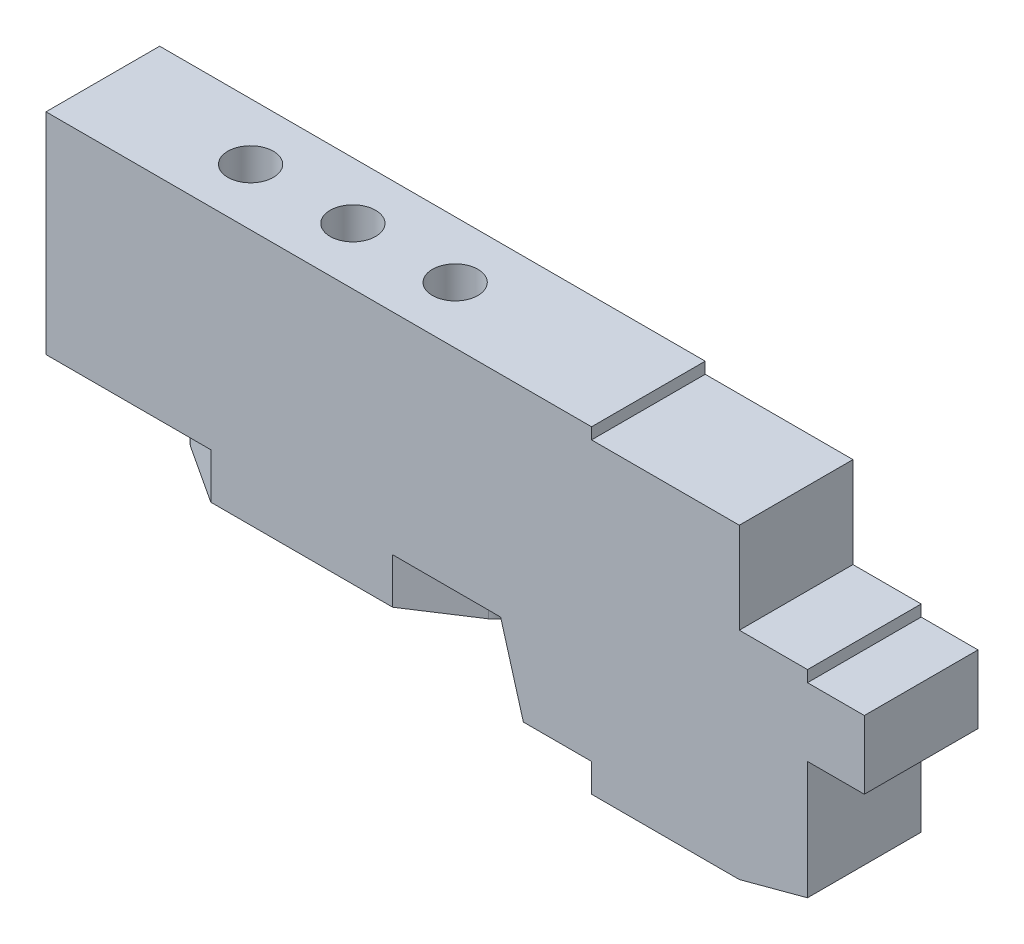
ISO-10303-21;
HEADER;
FILE_DESCRIPTION(('STEP AP214'),'2;1');
FILE_NAME('part.step','',(''),(''),'','','');
FILE_SCHEMA(('AUTOMOTIVE_DESIGN { 1 0 10303 214 1 1 1 1 }'));
ENDSEC;
DATA;
#1=APPLICATION_CONTEXT('core data for automotive mechanical design processes');
#2=APPLICATION_PROTOCOL_DEFINITION('international standard','automotive_design',2000,#1);
#3=PRODUCT_CONTEXT('',#1,'mechanical');
#4=PRODUCT('Part','Part','',(#3));
#5=PRODUCT_RELATED_PRODUCT_CATEGORY('part','',(#4));
#6=PRODUCT_DEFINITION_FORMATION('','',#4);
#7=PRODUCT_DEFINITION_CONTEXT('part definition',#1,'design');
#8=PRODUCT_DEFINITION('design','',#6,#7);
#9=PRODUCT_DEFINITION_SHAPE('','',#8);
#10=(LENGTH_UNIT() NAMED_UNIT(*) SI_UNIT(.MILLI.,.METRE.));
#11=(NAMED_UNIT(*) PLANE_ANGLE_UNIT() SI_UNIT($,.RADIAN.));
#12=(NAMED_UNIT(*) SI_UNIT($,.STERADIAN.) SOLID_ANGLE_UNIT());
#13=UNCERTAINTY_MEASURE_WITH_UNIT(LENGTH_MEASURE(1.E-05),#10,'distance_accuracy_value','');
#14=(GEOMETRIC_REPRESENTATION_CONTEXT(3) GLOBAL_UNCERTAINTY_ASSIGNED_CONTEXT((#13)) GLOBAL_UNIT_ASSIGNED_CONTEXT((#10,
#11,#12)) REPRESENTATION_CONTEXT('',''));
#15=CARTESIAN_POINT('',(0.,0.,0.));
#16=DIRECTION('',(0.,0.,1.));
#17=DIRECTION('',(1.,0.,0.));
#18=AXIS2_PLACEMENT_3D('',#15,#16,#17);
#19=CARTESIAN_POINT('',(16.,-9.25,10.));
#20=DIRECTION('',(0.,1.,0.));
#21=DIRECTION('',(-1.,0.,0.));
#22=AXIS2_PLACEMENT_3D('',#19,#20,#21);
#23=PLANE('',#22);
#24=DIRECTION('',(0.837342685882753,0.,0.546678357353441));
#25=VECTOR('',#24,1.);
#26=CARTESIAN_POINT('',(6.5,-9.25,0.));
#27=LINE('',#26,#25);
#28=CARTESIAN_POINT('',(6.5,-9.25,0.));
#29=VERTEX_POINT('',#28);
#30=CARTESIAN_POINT('',(11.5933567147069,-9.25,3.32531462823448));
#31=VERTEX_POINT('',#30);
#32=EDGE_CURVE('E389',#29,#31,#27,.T.);
#33=ORIENTED_EDGE('',*,*,#32,.F.);
#34=DIRECTION('',(1.,0.,0.));
#35=VECTOR('',#34,1.);
#36=CARTESIAN_POINT('',(16.,-9.25,0.));
#37=LINE('',#36,#35);
#38=CARTESIAN_POINT('',(16.,-9.25,0.));
#39=VERTEX_POINT('',#38);
#40=EDGE_CURVE('E231',#29,#39,#37,.T.);
#41=ORIENTED_EDGE('',*,*,#40,.T.);
#42=DIRECTION('',(0.,0.,-1.));
#43=VECTOR('',#42,1.);
#44=CARTESIAN_POINT('',(16.,-9.25,10.));
#45=LINE('',#44,#43);
#46=CARTESIAN_POINT('',(16.,-9.25,10.));
#47=VERTEX_POINT('',#46);
#48=EDGE_CURVE('E44',#47,#39,#45,.T.);
#49=ORIENTED_EDGE('',*,*,#48,.F.);
#50=DIRECTION('',(1.,0.,0.));
#51=VECTOR('',#50,1.);
#52=CARTESIAN_POINT('',(16.,-9.25,10.));
#53=LINE('',#52,#51);
#54=CARTESIAN_POINT('',(6.5,-9.25,10.));
#55=VERTEX_POINT('',#54);
#56=EDGE_CURVE('E240',#55,#47,#53,.T.);
#57=ORIENTED_EDGE('',*,*,#56,.F.);
#58=DIRECTION('',(-0.837342685882753,0.,0.546678357353441));
#59=VECTOR('',#58,1.);
#60=CARTESIAN_POINT('',(6.5,-9.25,10.));
#61=LINE('',#60,#59);
#62=CARTESIAN_POINT('',(11.5933567147069,-9.25,6.67468537176551));
#63=VERTEX_POINT('',#62);
#64=EDGE_CURVE('E56',#63,#55,#61,.T.);
#65=ORIENTED_EDGE('',*,*,#64,.F.);
#66=CARTESIAN_POINT('',(10.5,-9.25,5.));
#67=DIRECTION('',(0.,-1.,0.));
#68=DIRECTION('',(1.,0.,0.));
#69=AXIS2_PLACEMENT_3D('',#66,#67,#68);
#70=CIRCLE('',#69,2.);
#71=EDGE_CURVE('E51',#31,#63,#70,.T.);
#72=ORIENTED_EDGE('',*,*,#71,.F.);
#73=EDGE_LOOP('',(#33,#41,#49,#57,#65,#72));
#74=FACE_BOUND('',#73,.T.);
#75=ADVANCED_FACE('F36',(#74),#23,.F.);
#76=CARTESIAN_POINT('',(-24.,-9.25,10.));
#77=DIRECTION('',(1.,0.,0.));
#78=DIRECTION('',(0.,0.,-1.));
#79=AXIS2_PLACEMENT_3D('',#76,#77,#78);
#80=PLANE('',#79);
#81=DIRECTION('',(0.,-1.,0.));
#82=VECTOR('',#81,1.);
#83=CARTESIAN_POINT('',(-24.,-9.25,0.));
#84=LINE('',#83,#82);
#85=CARTESIAN_POINT('',(-24.,9.25,0.));
#86=VERTEX_POINT('',#85);
#87=CARTESIAN_POINT('',(-24.,-9.25,0.));
#88=VERTEX_POINT('',#87);
#89=EDGE_CURVE('E228',#86,#88,#84,.T.);
#90=ORIENTED_EDGE('',*,*,#89,.T.);
#91=DIRECTION('',(0.,0.,-1.));
#92=VECTOR('',#91,1.);
#93=CARTESIAN_POINT('',(-24.,-9.25,10.));
#94=LINE('',#93,#92);
#95=CARTESIAN_POINT('',(-24.,-9.25,10.));
#96=VERTEX_POINT('',#95);
#97=EDGE_CURVE('E11',#96,#88,#94,.T.);
#98=ORIENTED_EDGE('',*,*,#97,.F.);
#99=DIRECTION('',(0.,-1.,0.));
#100=VECTOR('',#99,1.);
#101=CARTESIAN_POINT('',(-24.,-9.25,10.));
#102=LINE('',#101,#100);
#103=CARTESIAN_POINT('',(-24.,9.25,10.));
#104=VERTEX_POINT('',#103);
#105=EDGE_CURVE('E237',#104,#96,#102,.T.);
#106=ORIENTED_EDGE('',*,*,#105,.F.);
#107=DIRECTION('',(0.,0.,-1.));
#108=VECTOR('',#107,1.);
#109=CARTESIAN_POINT('',(-24.,9.25,10.));
#110=LINE('',#109,#108);
#111=EDGE_CURVE('E274',#104,#86,#110,.T.);
#112=ORIENTED_EDGE('',*,*,#111,.T.);
#113=EDGE_LOOP('',(#90,#98,#106,#112));
#114=FACE_BOUND('',#113,.T.);
#115=ADVANCED_FACE('F38',(#114),#80,.F.);
#116=DIRECTION('',(0.837342685882753,0.,-0.546678357353441));
#117=VECTOR('',#116,1.);
#118=CARTESIAN_POINT('',(-14.5933567147069,-9.25,3.32531462823449));
#119=LINE('',#118,#117);
#120=CARTESIAN_POINT('',(-14.5933567147069,-9.25,3.32531462823449));
#121=VERTEX_POINT('',#120);
#122=CARTESIAN_POINT('',(-9.5,-9.25,0.));
#123=VERTEX_POINT('',#122);
#124=EDGE_CURVE('E419',#121,#123,#119,.T.);
#125=ORIENTED_EDGE('',*,*,#124,.F.);
#126=CARTESIAN_POINT('',(-13.5,-9.25,5.));
#127=DIRECTION('',(0.,-1.,0.));
#128=DIRECTION('',(1.,0.,0.));
#129=AXIS2_PLACEMENT_3D('',#126,#127,#128);
#130=CIRCLE('',#129,2.);
#131=CARTESIAN_POINT('',(-14.5933567147069,-9.25,6.67468537176551));
#132=VERTEX_POINT('',#131);
#133=EDGE_CURVE('E227',#132,#121,#130,.T.);
#134=ORIENTED_EDGE('',*,*,#133,.F.);
#135=DIRECTION('',(-0.837342685882753,0.,-0.546678357353441));
#136=VECTOR('',#135,1.);
#137=CARTESIAN_POINT('',(-14.5933567147069,-9.25,6.67468537176551));
#138=LINE('',#137,#136);
#139=CARTESIAN_POINT('',(-9.5,-9.25,10.));
#140=VERTEX_POINT('',#139);
#141=EDGE_CURVE('E224',#140,#132,#138,.T.);
#142=ORIENTED_EDGE('',*,*,#141,.F.);
#143=EDGE_CURVE('E242',#96,#140,#53,.T.);
#144=ORIENTED_EDGE('',*,*,#143,.F.);
#145=ORIENTED_EDGE('',*,*,#97,.T.);
#146=EDGE_CURVE('E276',#88,#123,#37,.T.);
#147=ORIENTED_EDGE('',*,*,#146,.T.);
#148=EDGE_LOOP('',(#125,#134,#142,#144,#145,#147));
#149=FACE_BOUND('',#148,.T.);
#150=ADVANCED_FACE('F422',(#149),#23,.F.);
#151=CARTESIAN_POINT('',(18.,-16.25,10.));
#152=DIRECTION('',(0.961523947640823,0.274721127897378,0.));
#153=DIRECTION('',(-0.274721127897378,0.961523947640823,0.));
#154=AXIS2_PLACEMENT_3D('',#151,#152,#153);
#155=PLANE('',#154);
#156=DIRECTION('',(0.274721127897378,-0.961523947640823,0.));
#157=VECTOR('',#156,1.);
#158=CARTESIAN_POINT('',(18.,-16.25,0.));
#159=LINE('',#158,#157);
#160=CARTESIAN_POINT('',(18.,-16.25,0.));
#161=VERTEX_POINT('',#160);
#162=EDGE_CURVE('E278',#39,#161,#159,.T.);
#163=ORIENTED_EDGE('',*,*,#162,.T.);
#164=DIRECTION('',(0.,0.,-1.));
#165=VECTOR('',#164,1.);
#166=CARTESIAN_POINT('',(18.,-16.25,10.));
#167=LINE('',#166,#165);
#168=CARTESIAN_POINT('',(18.,-16.25,10.));
#169=VERTEX_POINT('',#168);
#170=EDGE_CURVE('E348',#169,#161,#167,.T.);
#171=ORIENTED_EDGE('',*,*,#170,.F.);
#172=DIRECTION('',(0.274721127897378,-0.961523947640823,0.));
#173=VECTOR('',#172,1.);
#174=CARTESIAN_POINT('',(18.,-16.25,10.));
#175=LINE('',#174,#173);
#176=EDGE_CURVE('E245',#47,#169,#175,.T.);
#177=ORIENTED_EDGE('',*,*,#176,.F.);
#178=ORIENTED_EDGE('',*,*,#48,.T.);
#179=EDGE_LOOP('',(#163,#171,#177,#178));
#180=FACE_BOUND('',#179,.T.);
#181=ADVANCED_FACE('F355',(#180),#155,.F.);
#182=CARTESIAN_POINT('',(18.,-16.25,10.));
#183=DIRECTION('',(0.,1.,0.));
#184=DIRECTION('',(0.,0.,1.));
#185=AXIS2_PLACEMENT_3D('',#182,#183,#184);
#186=PLANE('',#185);
#187=DIRECTION('',(1.,0.,0.));
#188=VECTOR('',#187,1.);
#189=CARTESIAN_POINT('',(18.,-16.25,0.));
#190=LINE('',#189,#188);
#191=CARTESIAN_POINT('',(24.,-16.25,0.));
#192=VERTEX_POINT('',#191);
#193=EDGE_CURVE('E280',#161,#192,#190,.T.);
#194=ORIENTED_EDGE('',*,*,#193,.T.);
#195=DIRECTION('',(0.,0.,-1.));
#196=VECTOR('',#195,1.);
#197=CARTESIAN_POINT('',(24.,-16.25,10.));
#198=LINE('',#197,#196);
#199=CARTESIAN_POINT('',(24.,-16.25,10.));
#200=VERTEX_POINT('',#199);
#201=EDGE_CURVE('E345',#200,#192,#198,.T.);
#202=ORIENTED_EDGE('',*,*,#201,.F.);
#203=DIRECTION('',(1.,0.,0.));
#204=VECTOR('',#203,1.);
#205=CARTESIAN_POINT('',(18.,-16.25,10.));
#206=LINE('',#205,#204);
#207=EDGE_CURVE('E247',#169,#200,#206,.T.);
#208=ORIENTED_EDGE('',*,*,#207,.F.);
#209=ORIENTED_EDGE('',*,*,#170,.T.);
#210=EDGE_LOOP('',(#194,#202,#208,#209));
#211=FACE_BOUND('',#210,.T.);
#212=ADVANCED_FACE('F366',(#211),#186,.F.);
#213=CARTESIAN_POINT('',(24.,-16.25,10.));
#214=DIRECTION('',(1.,0.,0.));
#215=DIRECTION('',(0.,0.,-1.));
#216=AXIS2_PLACEMENT_3D('',#213,#214,#215);
#217=PLANE('',#216);
#218=DIRECTION('',(0.,-1.,0.));
#219=VECTOR('',#218,1.);
#220=CARTESIAN_POINT('',(24.,-16.25,0.));
#221=LINE('',#220,#219);
#222=CARTESIAN_POINT('',(24.,-18.75,0.));
#223=VERTEX_POINT('',#222);
#224=EDGE_CURVE('E282',#192,#223,#221,.T.);
#225=ORIENTED_EDGE('',*,*,#224,.T.);
#226=DIRECTION('',(0.,0.,-1.));
#227=VECTOR('',#226,1.);
#228=CARTESIAN_POINT('',(24.,-18.75,10.));
#229=LINE('',#228,#227);
#230=CARTESIAN_POINT('',(24.,-18.75,10.));
#231=VERTEX_POINT('',#230);
#232=EDGE_CURVE('E342',#231,#223,#229,.T.);
#233=ORIENTED_EDGE('',*,*,#232,.F.);
#234=DIRECTION('',(0.,-1.,0.));
#235=VECTOR('',#234,1.);
#236=CARTESIAN_POINT('',(24.,-16.25,10.));
#237=LINE('',#236,#235);
#238=EDGE_CURVE('E249',#200,#231,#237,.T.);
#239=ORIENTED_EDGE('',*,*,#238,.F.);
#240=ORIENTED_EDGE('',*,*,#201,.T.);
#241=EDGE_LOOP('',(#225,#233,#239,#240));
#242=FACE_BOUND('',#241,.T.);
#243=ADVANCED_FACE('F370',(#242),#217,.F.);
#244=CARTESIAN_POINT('',(24.,-18.75,10.));
#245=DIRECTION('',(0.,1.,0.));
#246=DIRECTION('',(0.,0.,1.));
#247=AXIS2_PLACEMENT_3D('',#244,#245,#246);
#248=PLANE('',#247);
#249=DIRECTION('',(1.,0.,0.));
#250=VECTOR('',#249,1.);
#251=CARTESIAN_POINT('',(24.,-18.75,0.));
#252=LINE('',#251,#250);
#253=CARTESIAN_POINT('',(37.,-18.75,0.));
#254=VERTEX_POINT('',#253);
#255=EDGE_CURVE('E284',#223,#254,#252,.T.);
#256=ORIENTED_EDGE('',*,*,#255,.T.);
#257=DIRECTION('',(0.,0.,-1.));
#258=VECTOR('',#257,1.);
#259=CARTESIAN_POINT('',(37.,-18.75,10.));
#260=LINE('',#259,#258);
#261=CARTESIAN_POINT('',(37.,-18.75,10.));
#262=VERTEX_POINT('',#261);
#263=EDGE_CURVE('E339',#262,#254,#260,.T.);
#264=ORIENTED_EDGE('',*,*,#263,.F.);
#265=DIRECTION('',(1.,0.,0.));
#266=VECTOR('',#265,1.);
#267=CARTESIAN_POINT('',(24.,-18.75,10.));
#268=LINE('',#267,#266);
#269=EDGE_CURVE('E251',#231,#262,#268,.T.);
#270=ORIENTED_EDGE('',*,*,#269,.F.);
#271=ORIENTED_EDGE('',*,*,#232,.T.);
#272=EDGE_LOOP('',(#256,#264,#270,#271));
#273=FACE_BOUND('',#272,.T.);
#274=ADVANCED_FACE('F482',(#273),#248,.F.);
#275=CARTESIAN_POINT('',(37.,-18.75,10.));
#276=DIRECTION('',(-0.258819045102522,0.965925826289068,0.));
#277=DIRECTION('',(-0.965925826289068,-0.258819045102522,0.));
#278=AXIS2_PLACEMENT_3D('',#275,#276,#277);
#279=PLANE('',#278);
#280=DIRECTION('',(0.965925826289068,0.258819045102522,0.));
#281=VECTOR('',#280,1.);
#282=CARTESIAN_POINT('',(37.,-18.75,0.));
#283=LINE('',#282,#281);
#284=CARTESIAN_POINT('',(43.,-17.1423048454132,0.));
#285=VERTEX_POINT('',#284);
#286=EDGE_CURVE('E286',#254,#285,#283,.T.);
#287=ORIENTED_EDGE('',*,*,#286,.T.);
#288=DIRECTION('',(0.,0.,-1.));
#289=VECTOR('',#288,1.);
#290=CARTESIAN_POINT('',(43.,-17.1423048454132,10.));
#291=LINE('',#290,#289);
#292=CARTESIAN_POINT('',(43.,-17.1423048454132,10.));
#293=VERTEX_POINT('',#292);
#294=EDGE_CURVE('E336',#293,#285,#291,.T.);
#295=ORIENTED_EDGE('',*,*,#294,.F.);
#296=DIRECTION('',(0.965925826289068,0.258819045102522,0.));
#297=VECTOR('',#296,1.);
#298=CARTESIAN_POINT('',(37.,-18.75,10.));
#299=LINE('',#298,#297);
#300=EDGE_CURVE('E253',#262,#293,#299,.T.);
#301=ORIENTED_EDGE('',*,*,#300,.F.);
#302=ORIENTED_EDGE('',*,*,#263,.T.);
#303=EDGE_LOOP('',(#287,#295,#301,#302));
#304=FACE_BOUND('',#303,.T.);
#305=ADVANCED_FACE('F480',(#304),#279,.F.);
#306=CARTESIAN_POINT('',(43.,-17.1423048454132,10.));
#307=DIRECTION('',(-1.,0.,0.));
#308=DIRECTION('',(0.,0.,1.));
#309=AXIS2_PLACEMENT_3D('',#306,#307,#308);
#310=PLANE('',#309);
#311=DIRECTION('',(0.,1.,0.));
#312=VECTOR('',#311,1.);
#313=CARTESIAN_POINT('',(43.,-17.1423048454132,0.));
#314=LINE('',#313,#312);
#315=CARTESIAN_POINT('',(43.,-6.74999999999999,0.));
#316=VERTEX_POINT('',#315);
#317=EDGE_CURVE('E288',#285,#316,#314,.T.);
#318=ORIENTED_EDGE('',*,*,#317,.T.);
#319=DIRECTION('',(0.,0.,-1.));
#320=VECTOR('',#319,1.);
#321=CARTESIAN_POINT('',(43.,-6.74999999999999,10.));
#322=LINE('',#321,#320);
#323=CARTESIAN_POINT('',(43.,-6.74999999999999,10.));
#324=VERTEX_POINT('',#323);
#325=EDGE_CURVE('E333',#324,#316,#322,.T.);
#326=ORIENTED_EDGE('',*,*,#325,.F.);
#327=DIRECTION('',(0.,1.,0.));
#328=VECTOR('',#327,1.);
#329=CARTESIAN_POINT('',(43.,-17.1423048454132,10.));
#330=LINE('',#329,#328);
#331=EDGE_CURVE('E255',#293,#324,#330,.T.);
#332=ORIENTED_EDGE('',*,*,#331,.F.);
#333=ORIENTED_EDGE('',*,*,#294,.T.);
#334=EDGE_LOOP('',(#318,#326,#332,#333));
#335=FACE_BOUND('',#334,.T.);
#336=ADVANCED_FACE('F476',(#335),#310,.F.);
#337=CARTESIAN_POINT('',(43.,-6.74999999999999,10.));
#338=DIRECTION('',(0.,1.,0.));
#339=DIRECTION('',(0.,0.,1.));
#340=AXIS2_PLACEMENT_3D('',#337,#338,#339);
#341=PLANE('',#340);
#342=DIRECTION('',(1.,0.,0.));
#343=VECTOR('',#342,1.);
#344=CARTESIAN_POINT('',(43.,-6.74999999999999,0.));
#345=LINE('',#344,#343);
#346=CARTESIAN_POINT('',(48.,-6.74999999999999,0.));
#347=VERTEX_POINT('',#346);
#348=EDGE_CURVE('E290',#316,#347,#345,.T.);
#349=ORIENTED_EDGE('',*,*,#348,.T.);
#350=DIRECTION('',(0.,0.,-1.));
#351=VECTOR('',#350,1.);
#352=CARTESIAN_POINT('',(48.,-6.74999999999999,10.));
#353=LINE('',#352,#351);
#354=CARTESIAN_POINT('',(48.,-6.74999999999999,10.));
#355=VERTEX_POINT('',#354);
#356=EDGE_CURVE('E330',#355,#347,#353,.T.);
#357=ORIENTED_EDGE('',*,*,#356,.F.);
#358=DIRECTION('',(1.,0.,0.));
#359=VECTOR('',#358,1.);
#360=CARTESIAN_POINT('',(43.,-6.74999999999999,10.));
#361=LINE('',#360,#359);
#362=EDGE_CURVE('E257',#324,#355,#361,.T.);
#363=ORIENTED_EDGE('',*,*,#362,.F.);
#364=ORIENTED_EDGE('',*,*,#325,.T.);
#365=EDGE_LOOP('',(#349,#357,#363,#364));
#366=FACE_BOUND('',#365,.T.);
#367=ADVANCED_FACE('F471',(#366),#341,.F.);
#368=CARTESIAN_POINT('',(48.,-6.74999999999999,10.));
#369=DIRECTION('',(-1.,0.,0.));
#370=DIRECTION('',(0.,0.,1.));
#371=AXIS2_PLACEMENT_3D('',#368,#369,#370);
#372=PLANE('',#371);
#373=DIRECTION('',(0.,1.,0.));
#374=VECTOR('',#373,1.);
#375=CARTESIAN_POINT('',(48.,-6.74999999999999,0.));
#376=LINE('',#375,#374);
#377=CARTESIAN_POINT('',(48.,-0.749999999999994,0.));
#378=VERTEX_POINT('',#377);
#379=EDGE_CURVE('E292',#347,#378,#376,.T.);
#380=ORIENTED_EDGE('',*,*,#379,.T.);
#381=DIRECTION('',(0.,0.,-1.));
#382=VECTOR('',#381,1.);
#383=CARTESIAN_POINT('',(48.,-0.749999999999994,10.));
#384=LINE('',#383,#382);
#385=CARTESIAN_POINT('',(48.,-0.749999999999994,10.));
#386=VERTEX_POINT('',#385);
#387=EDGE_CURVE('E327',#386,#378,#384,.T.);
#388=ORIENTED_EDGE('',*,*,#387,.F.);
#389=DIRECTION('',(0.,1.,0.));
#390=VECTOR('',#389,1.);
#391=CARTESIAN_POINT('',(48.,-6.74999999999999,10.));
#392=LINE('',#391,#390);
#393=EDGE_CURVE('E259',#355,#386,#392,.T.);
#394=ORIENTED_EDGE('',*,*,#393,.F.);
#395=ORIENTED_EDGE('',*,*,#356,.T.);
#396=EDGE_LOOP('',(#380,#388,#394,#395));
#397=FACE_BOUND('',#396,.T.);
#398=ADVANCED_FACE('F465',(#397),#372,.F.);
#399=CARTESIAN_POINT('',(48.,-0.749999999999994,10.));
#400=DIRECTION('',(0.,-1.,0.));
#401=DIRECTION('',(1.,0.,0.));
#402=AXIS2_PLACEMENT_3D('',#399,#400,#401);
#403=PLANE('',#402);
#404=DIRECTION('',(-1.,0.,0.));
#405=VECTOR('',#404,1.);
#406=CARTESIAN_POINT('',(48.,-0.749999999999994,0.));
#407=LINE('',#406,#405);
#408=CARTESIAN_POINT('',(43.,-0.749999999999995,0.));
#409=VERTEX_POINT('',#408);
#410=EDGE_CURVE('E294',#378,#409,#407,.T.);
#411=ORIENTED_EDGE('',*,*,#410,.T.);
#412=DIRECTION('',(0.,0.,-1.));
#413=VECTOR('',#412,1.);
#414=CARTESIAN_POINT('',(43.,-0.749999999999995,10.));
#415=LINE('',#414,#413);
#416=CARTESIAN_POINT('',(43.,-0.749999999999995,10.));
#417=VERTEX_POINT('',#416);
#418=EDGE_CURVE('E324',#417,#409,#415,.T.);
#419=ORIENTED_EDGE('',*,*,#418,.F.);
#420=DIRECTION('',(-1.,0.,0.));
#421=VECTOR('',#420,1.);
#422=CARTESIAN_POINT('',(48.,-0.749999999999994,10.));
#423=LINE('',#422,#421);
#424=EDGE_CURVE('E261',#386,#417,#423,.T.);
#425=ORIENTED_EDGE('',*,*,#424,.F.);
#426=ORIENTED_EDGE('',*,*,#387,.T.);
#427=EDGE_LOOP('',(#411,#419,#425,#426));
#428=FACE_BOUND('',#427,.T.);
#429=ADVANCED_FACE('F461',(#428),#403,.F.);
#430=CARTESIAN_POINT('',(43.,-0.749999999999995,10.));
#431=DIRECTION('',(-1.,0.,0.));
#432=DIRECTION('',(0.,0.,1.));
#433=AXIS2_PLACEMENT_3D('',#430,#431,#432);
#434=PLANE('',#433);
#435=DIRECTION('',(0.,1.,0.));
#436=VECTOR('',#435,1.);
#437=CARTESIAN_POINT('',(43.,-0.749999999999995,0.));
#438=LINE('',#437,#436);
#439=CARTESIAN_POINT('',(43.,0.250000000000006,0.));
#440=VERTEX_POINT('',#439);
#441=EDGE_CURVE('E296',#409,#440,#438,.T.);
#442=ORIENTED_EDGE('',*,*,#441,.T.);
#443=DIRECTION('',(0.,0.,-1.));
#444=VECTOR('',#443,1.);
#445=CARTESIAN_POINT('',(43.,0.250000000000006,10.));
#446=LINE('',#445,#444);
#447=CARTESIAN_POINT('',(43.,0.250000000000006,10.));
#448=VERTEX_POINT('',#447);
#449=EDGE_CURVE('E321',#448,#440,#446,.T.);
#450=ORIENTED_EDGE('',*,*,#449,.F.);
#451=DIRECTION('',(0.,1.,0.));
#452=VECTOR('',#451,1.);
#453=CARTESIAN_POINT('',(43.,-0.749999999999995,10.));
#454=LINE('',#453,#452);
#455=EDGE_CURVE('E263',#417,#448,#454,.T.);
#456=ORIENTED_EDGE('',*,*,#455,.F.);
#457=ORIENTED_EDGE('',*,*,#418,.T.);
#458=EDGE_LOOP('',(#442,#450,#456,#457));
#459=FACE_BOUND('',#458,.T.);
#460=ADVANCED_FACE('F456',(#459),#434,.F.);
#461=CARTESIAN_POINT('',(43.,0.250000000000006,10.));
#462=DIRECTION('',(0.,-1.,0.));
#463=DIRECTION('',(1.,0.,0.));
#464=AXIS2_PLACEMENT_3D('',#461,#462,#463);
#465=PLANE('',#464);
#466=DIRECTION('',(-1.,0.,0.));
#467=VECTOR('',#466,1.);
#468=CARTESIAN_POINT('',(43.,0.250000000000006,0.));
#469=LINE('',#468,#467);
#470=CARTESIAN_POINT('',(37.,0.250000000000005,0.));
#471=VERTEX_POINT('',#470);
#472=EDGE_CURVE('E298',#440,#471,#469,.T.);
#473=ORIENTED_EDGE('',*,*,#472,.T.);
#474=DIRECTION('',(0.,0.,-1.));
#475=VECTOR('',#474,1.);
#476=CARTESIAN_POINT('',(37.,0.250000000000005,10.));
#477=LINE('',#476,#475);
#478=CARTESIAN_POINT('',(37.,0.250000000000005,10.));
#479=VERTEX_POINT('',#478);
#480=EDGE_CURVE('E318',#479,#471,#477,.T.);
#481=ORIENTED_EDGE('',*,*,#480,.F.);
#482=DIRECTION('',(-1.,0.,0.));
#483=VECTOR('',#482,1.);
#484=CARTESIAN_POINT('',(43.,0.250000000000006,10.));
#485=LINE('',#484,#483);
#486=EDGE_CURVE('E265',#448,#479,#485,.T.);
#487=ORIENTED_EDGE('',*,*,#486,.F.);
#488=ORIENTED_EDGE('',*,*,#449,.T.);
#489=EDGE_LOOP('',(#473,#481,#487,#488));
#490=FACE_BOUND('',#489,.T.);
#491=ADVANCED_FACE('F450',(#490),#465,.F.);
#492=CARTESIAN_POINT('',(37.,0.250000000000005,10.));
#493=DIRECTION('',(-1.,0.,0.));
#494=DIRECTION('',(0.,0.,1.));
#495=AXIS2_PLACEMENT_3D('',#492,#493,#494);
#496=PLANE('',#495);
#497=DIRECTION('',(0.,1.,0.));
#498=VECTOR('',#497,1.);
#499=CARTESIAN_POINT('',(37.,0.250000000000005,0.));
#500=LINE('',#499,#498);
#501=CARTESIAN_POINT('',(37.,8.25000000000001,0.));
#502=VERTEX_POINT('',#501);
#503=EDGE_CURVE('E300',#471,#502,#500,.T.);
#504=ORIENTED_EDGE('',*,*,#503,.T.);
#505=DIRECTION('',(0.,0.,-1.));
#506=VECTOR('',#505,1.);
#507=CARTESIAN_POINT('',(37.,8.25000000000001,10.));
#508=LINE('',#507,#506);
#509=CARTESIAN_POINT('',(37.,8.25000000000001,10.));
#510=VERTEX_POINT('',#509);
#511=EDGE_CURVE('E315',#510,#502,#508,.T.);
#512=ORIENTED_EDGE('',*,*,#511,.F.);
#513=DIRECTION('',(0.,1.,0.));
#514=VECTOR('',#513,1.);
#515=CARTESIAN_POINT('',(37.,0.250000000000005,10.));
#516=LINE('',#515,#514);
#517=EDGE_CURVE('E267',#479,#510,#516,.T.);
#518=ORIENTED_EDGE('',*,*,#517,.F.);
#519=ORIENTED_EDGE('',*,*,#480,.T.);
#520=EDGE_LOOP('',(#504,#512,#518,#519));
#521=FACE_BOUND('',#520,.T.);
#522=ADVANCED_FACE('F446',(#521),#496,.F.);
#523=CARTESIAN_POINT('',(37.,8.25000000000001,10.));
#524=DIRECTION('',(0.,-1.,0.));
#525=DIRECTION('',(1.,0.,0.));
#526=AXIS2_PLACEMENT_3D('',#523,#524,#525);
#527=PLANE('',#526);
#528=DIRECTION('',(-1.,0.,0.));
#529=VECTOR('',#528,1.);
#530=CARTESIAN_POINT('',(37.,8.25000000000001,0.));
#531=LINE('',#530,#529);
#532=CARTESIAN_POINT('',(24.,8.25,0.));
#533=VERTEX_POINT('',#532);
#534=EDGE_CURVE('E302',#502,#533,#531,.T.);
#535=ORIENTED_EDGE('',*,*,#534,.T.);
#536=DIRECTION('',(0.,0.,-1.));
#537=VECTOR('',#536,1.);
#538=CARTESIAN_POINT('',(24.,8.25,10.));
#539=LINE('',#538,#537);
#540=CARTESIAN_POINT('',(24.,8.25,10.));
#541=VERTEX_POINT('',#540);
#542=EDGE_CURVE('E312',#541,#533,#539,.T.);
#543=ORIENTED_EDGE('',*,*,#542,.F.);
#544=DIRECTION('',(-1.,0.,0.));
#545=VECTOR('',#544,1.);
#546=CARTESIAN_POINT('',(37.,8.25000000000001,10.));
#547=LINE('',#546,#545);
#548=EDGE_CURVE('E269',#510,#541,#547,.T.);
#549=ORIENTED_EDGE('',*,*,#548,.F.);
#550=ORIENTED_EDGE('',*,*,#511,.T.);
#551=EDGE_LOOP('',(#535,#543,#549,#550));
#552=FACE_BOUND('',#551,.T.);
#553=ADVANCED_FACE('F441',(#552),#527,.F.);
#554=CARTESIAN_POINT('',(24.,8.25,10.));
#555=DIRECTION('',(-1.,0.,0.));
#556=DIRECTION('',(0.,0.,1.));
#557=AXIS2_PLACEMENT_3D('',#554,#555,#556);
#558=PLANE('',#557);
#559=DIRECTION('',(0.,1.,0.));
#560=VECTOR('',#559,1.);
#561=CARTESIAN_POINT('',(24.,8.25,0.));
#562=LINE('',#561,#560);
#563=CARTESIAN_POINT('',(24.,9.25,0.));
#564=VERTEX_POINT('',#563);
#565=EDGE_CURVE('E304',#533,#564,#562,.T.);
#566=ORIENTED_EDGE('',*,*,#565,.T.);
#567=DIRECTION('',(0.,0.,-1.));
#568=VECTOR('',#567,1.);
#569=CARTESIAN_POINT('',(24.,9.25,10.));
#570=LINE('',#569,#568);
#571=CARTESIAN_POINT('',(24.,9.25,10.));
#572=VERTEX_POINT('',#571);
#573=EDGE_CURVE('E309',#572,#564,#570,.T.);
#574=ORIENTED_EDGE('',*,*,#573,.F.);
#575=DIRECTION('',(0.,1.,0.));
#576=VECTOR('',#575,1.);
#577=CARTESIAN_POINT('',(24.,8.25,10.));
#578=LINE('',#577,#576);
#579=EDGE_CURVE('E271',#541,#572,#578,.T.);
#580=ORIENTED_EDGE('',*,*,#579,.F.);
#581=ORIENTED_EDGE('',*,*,#542,.T.);
#582=EDGE_LOOP('',(#566,#574,#580,#581));
#583=FACE_BOUND('',#582,.T.);
#584=ADVANCED_FACE('F435',(#583),#558,.F.);
#585=CARTESIAN_POINT('',(24.,9.25,10.));
#586=DIRECTION('',(0.,-1.,0.));
#587=DIRECTION('',(1.,0.,0.));
#588=AXIS2_PLACEMENT_3D('',#585,#586,#587);
#589=PLANE('',#588);
#590=CARTESIAN_POINT('',(6.99999999999999,9.25,5.));
#591=DIRECTION('',(0.,1.,0.));
#592=DIRECTION('',(-1.,0.,0.));
#593=AXIS2_PLACEMENT_3D('',#590,#591,#592);
#594=CIRCLE('',#593,2.);
#595=CARTESIAN_POINT('',(4.99999999999999,9.25,5.));
#596=VERTEX_POINT('',#595);
#597=EDGE_CURVE('E757',#596,#596,#594,.T.);
#598=ORIENTED_EDGE('',*,*,#597,.F.);
#599=EDGE_LOOP('',(#598));
#600=FACE_BOUND('',#599,.T.);
#601=CARTESIAN_POINT('',(-11.,9.25,5.));
#602=DIRECTION('',(0.,1.,0.));
#603=DIRECTION('',(-1.,0.,0.));
#604=AXIS2_PLACEMENT_3D('',#601,#602,#603);
#605=CIRCLE('',#604,2.);
#606=CARTESIAN_POINT('',(-13.,9.25,5.));
#607=VERTEX_POINT('',#606);
#608=EDGE_CURVE('E756',#607,#607,#605,.T.);
#609=ORIENTED_EDGE('',*,*,#608,.F.);
#610=EDGE_LOOP('',(#609));
#611=FACE_BOUND('',#610,.T.);
#612=CARTESIAN_POINT('',(-2.00000000000001,9.25,5.));
#613=DIRECTION('',(0.,1.,0.));
#614=DIRECTION('',(-1.,0.,0.));
#615=AXIS2_PLACEMENT_3D('',#612,#613,#614);
#616=CIRCLE('',#615,2.);
#617=CARTESIAN_POINT('',(-4.00000000000001,9.25,5.));
#618=VERTEX_POINT('',#617);
#619=EDGE_CURVE('E525',#618,#618,#616,.T.);
#620=ORIENTED_EDGE('',*,*,#619,.F.);
#621=EDGE_LOOP('',(#620));
#622=FACE_BOUND('',#621,.T.);
#623=DIRECTION('',(-1.,0.,0.));
#624=VECTOR('',#623,1.);
#625=CARTESIAN_POINT('',(24.,9.25,0.));
#626=LINE('',#625,#624);
#627=EDGE_CURVE('E241',#564,#86,#626,.T.);
#628=ORIENTED_EDGE('',*,*,#627,.T.);
#629=ORIENTED_EDGE('',*,*,#111,.F.);
#630=DIRECTION('',(-1.,0.,0.));
#631=VECTOR('',#630,1.);
#632=CARTESIAN_POINT('',(24.,9.25,10.));
#633=LINE('',#632,#631);
#634=EDGE_CURVE('E273',#572,#104,#633,.T.);
#635=ORIENTED_EDGE('',*,*,#634,.F.);
#636=ORIENTED_EDGE('',*,*,#573,.T.);
#637=EDGE_LOOP('',(#628,#629,#635,#636));
#638=FACE_BOUND('',#637,.T.);
#639=ADVANCED_FACE('F431',(#600,#611,#622,#638),#589,.F.);
#640=CARTESIAN_POINT('',(0.,0.,10.));
#641=DIRECTION('',(0.,0.,1.));
#642=DIRECTION('',(1.,0.,0.));
#643=AXIS2_PLACEMENT_3D('',#640,#641,#642);
#644=PLANE('',#643);
#645=ORIENTED_EDGE('',*,*,#105,.T.);
#646=ORIENTED_EDGE('',*,*,#143,.T.);
#647=DIRECTION('',(0.,1.,0.));
#648=VECTOR('',#647,1.);
#649=CARTESIAN_POINT('',(-9.5,-13.25,10.));
#650=LINE('',#649,#648);
#651=CARTESIAN_POINT('',(-9.5,-13.25,10.));
#652=VERTEX_POINT('',#651);
#653=EDGE_CURVE('E395',#652,#140,#650,.T.);
#654=ORIENTED_EDGE('',*,*,#653,.F.);
#655=DIRECTION('',(-1.,0.,0.));
#656=VECTOR('',#655,1.);
#657=CARTESIAN_POINT('',(-9.5,-13.25,10.));
#658=LINE('',#657,#656);
#659=CARTESIAN_POINT('',(6.5,-13.25,10.));
#660=VERTEX_POINT('',#659);
#661=EDGE_CURVE('E415',#660,#652,#658,.T.);
#662=ORIENTED_EDGE('',*,*,#661,.F.);
#663=DIRECTION('',(0.,1.,0.));
#664=VECTOR('',#663,1.);
#665=CARTESIAN_POINT('',(6.5,-13.25,10.));
#666=LINE('',#665,#664);
#667=EDGE_CURVE('E379',#660,#55,#666,.T.);
#668=ORIENTED_EDGE('',*,*,#667,.T.);
#669=ORIENTED_EDGE('',*,*,#56,.T.);
#670=ORIENTED_EDGE('',*,*,#176,.T.);
#671=ORIENTED_EDGE('',*,*,#207,.T.);
#672=ORIENTED_EDGE('',*,*,#238,.T.);
#673=ORIENTED_EDGE('',*,*,#269,.T.);
#674=ORIENTED_EDGE('',*,*,#300,.T.);
#675=ORIENTED_EDGE('',*,*,#331,.T.);
#676=ORIENTED_EDGE('',*,*,#362,.T.);
#677=ORIENTED_EDGE('',*,*,#393,.T.);
#678=ORIENTED_EDGE('',*,*,#424,.T.);
#679=ORIENTED_EDGE('',*,*,#455,.T.);
#680=ORIENTED_EDGE('',*,*,#486,.T.);
#681=ORIENTED_EDGE('',*,*,#517,.T.);
#682=ORIENTED_EDGE('',*,*,#548,.T.);
#683=ORIENTED_EDGE('',*,*,#579,.T.);
#684=ORIENTED_EDGE('',*,*,#634,.T.);
#685=EDGE_LOOP('',(#645,#646,#654,#662,#668,#669,#670,#671,#672,#673,#674,#675,#676,#677,#678,
#679,#680,#681,#682,#683,#684));
#686=FACE_BOUND('',#685,.T.);
#687=ADVANCED_FACE('F374',(#686),#644,.T.);
#688=CARTESIAN_POINT('',(0.,0.,0.));
#689=DIRECTION('',(0.,0.,1.));
#690=DIRECTION('',(1.,0.,0.));
#691=AXIS2_PLACEMENT_3D('',#688,#689,#690);
#692=PLANE('',#691);
#693=ORIENTED_EDGE('',*,*,#89,.F.);
#694=ORIENTED_EDGE('',*,*,#627,.F.);
#695=ORIENTED_EDGE('',*,*,#565,.F.);
#696=ORIENTED_EDGE('',*,*,#534,.F.);
#697=ORIENTED_EDGE('',*,*,#503,.F.);
#698=ORIENTED_EDGE('',*,*,#472,.F.);
#699=ORIENTED_EDGE('',*,*,#441,.F.);
#700=ORIENTED_EDGE('',*,*,#410,.F.);
#701=ORIENTED_EDGE('',*,*,#379,.F.);
#702=ORIENTED_EDGE('',*,*,#348,.F.);
#703=ORIENTED_EDGE('',*,*,#317,.F.);
#704=ORIENTED_EDGE('',*,*,#286,.F.);
#705=ORIENTED_EDGE('',*,*,#255,.F.);
#706=ORIENTED_EDGE('',*,*,#224,.F.);
#707=ORIENTED_EDGE('',*,*,#193,.F.);
#708=ORIENTED_EDGE('',*,*,#162,.F.);
#709=ORIENTED_EDGE('',*,*,#40,.F.);
#710=DIRECTION('',(0.,1.,0.));
#711=VECTOR('',#710,1.);
#712=CARTESIAN_POINT('',(6.5,-13.25,0.));
#713=LINE('',#712,#711);
#714=CARTESIAN_POINT('',(6.5,-13.25,0.));
#715=VERTEX_POINT('',#714);
#716=EDGE_CURVE('E233',#715,#29,#713,.T.);
#717=ORIENTED_EDGE('',*,*,#716,.F.);
#718=DIRECTION('',(1.,0.,0.));
#719=VECTOR('',#718,1.);
#720=CARTESIAN_POINT('',(-9.5,-13.25,0.));
#721=LINE('',#720,#719);
#722=CARTESIAN_POINT('',(-9.5,-13.25,0.));
#723=VERTEX_POINT('',#722);
#724=EDGE_CURVE('E213',#723,#715,#721,.T.);
#725=ORIENTED_EDGE('',*,*,#724,.F.);
#726=DIRECTION('',(0.,1.,0.));
#727=VECTOR('',#726,1.);
#728=CARTESIAN_POINT('',(-9.5,-13.25,0.));
#729=LINE('',#728,#727);
#730=EDGE_CURVE('E210',#723,#123,#729,.T.);
#731=ORIENTED_EDGE('',*,*,#730,.T.);
#732=ORIENTED_EDGE('',*,*,#146,.F.);
#733=EDGE_LOOP('',(#693,#694,#695,#696,#697,#698,#699,#700,#701,#702,#703,#704,#705,#706,#707,
#708,#709,#717,#725,#731,#732));
#734=FACE_BOUND('',#733,.T.);
#735=ADVANCED_FACE('F360',(#734),#692,.F.);
#736=CARTESIAN_POINT('',(-13.5,-13.25,5.));
#737=DIRECTION('',(0.,-1.,0.));
#738=DIRECTION('',(1.,0.,0.));
#739=AXIS2_PLACEMENT_3D('',#736,#737,#738);
#740=PLANE('',#739);
#741=CARTESIAN_POINT('',(-6.75,-13.25,5.));
#742=DIRECTION('',(0.,-1.,0.));
#743=DIRECTION('',(1.,0.,0.));
#744=AXIS2_PLACEMENT_3D('',#741,#742,#743);
#745=CIRCLE('',#744,2.);
#746=CARTESIAN_POINT('',(-4.75,-13.25,5.));
#747=VERTEX_POINT('',#746);
#748=EDGE_CURVE('E420',#747,#747,#745,.T.);
#749=ORIENTED_EDGE('',*,*,#748,.F.);
#750=EDGE_LOOP('',(#749));
#751=FACE_BOUND('',#750,.T.);
#752=CARTESIAN_POINT('',(-13.5,-13.25,5.));
#753=DIRECTION('',(0.,-1.,0.));
#754=DIRECTION('',(1.,0.,0.));
#755=AXIS2_PLACEMENT_3D('',#752,#753,#754);
#756=CIRCLE('',#755,2.);
#757=CARTESIAN_POINT('',(-14.5933567147069,-13.25,6.67468537176551));
#758=VERTEX_POINT('',#757);
#759=CARTESIAN_POINT('',(-14.5933567147069,-13.25,3.32531462823449));
#760=VERTEX_POINT('',#759);
#761=EDGE_CURVE('E214',#758,#760,#756,.T.);
#762=ORIENTED_EDGE('',*,*,#761,.T.);
#763=DIRECTION('',(0.837342685882753,0.,-0.546678357353441));
#764=VECTOR('',#763,1.);
#765=CARTESIAN_POINT('',(-14.5933567147069,-13.25,3.32531462823449));
#766=LINE('',#765,#764);
#767=EDGE_CURVE('E202',#760,#723,#766,.T.);
#768=ORIENTED_EDGE('',*,*,#767,.T.);
#769=ORIENTED_EDGE('',*,*,#724,.T.);
#770=DIRECTION('',(0.837342685882753,0.,0.546678357353441));
#771=VECTOR('',#770,1.);
#772=CARTESIAN_POINT('',(6.5,-13.25,0.));
#773=LINE('',#772,#771);
#774=CARTESIAN_POINT('',(11.5933567147069,-13.25,3.32531462823448));
#775=VERTEX_POINT('',#774);
#776=EDGE_CURVE('E407',#715,#775,#773,.T.);
#777=ORIENTED_EDGE('',*,*,#776,.T.);
#778=CARTESIAN_POINT('',(10.5,-13.25,5.));
#779=DIRECTION('',(0.,-1.,0.));
#780=DIRECTION('',(1.,0.,0.));
#781=AXIS2_PLACEMENT_3D('',#778,#779,#780);
#782=CIRCLE('',#781,2.);
#783=CARTESIAN_POINT('',(11.5933567147069,-13.25,6.67468537176551));
#784=VERTEX_POINT('',#783);
#785=EDGE_CURVE('E409',#775,#784,#782,.T.);
#786=ORIENTED_EDGE('',*,*,#785,.T.);
#787=DIRECTION('',(-0.837342685882753,0.,0.546678357353441));
#788=VECTOR('',#787,1.);
#789=CARTESIAN_POINT('',(6.5,-13.25,10.));
#790=LINE('',#789,#788);
#791=EDGE_CURVE('E413',#784,#660,#790,.T.);
#792=ORIENTED_EDGE('',*,*,#791,.T.);
#793=ORIENTED_EDGE('',*,*,#661,.T.);
#794=DIRECTION('',(-0.837342685882753,0.,-0.546678357353441));
#795=VECTOR('',#794,1.);
#796=CARTESIAN_POINT('',(-14.5933567147069,-13.25,6.67468537176551));
#797=LINE('',#796,#795);
#798=EDGE_CURVE('E220',#652,#758,#797,.T.);
#799=ORIENTED_EDGE('',*,*,#798,.T.);
#800=EDGE_LOOP('',(#762,#768,#769,#777,#786,#792,#793,#799));
#801=FACE_BOUND('',#800,.T.);
#802=CARTESIAN_POINT('',(3.75,-13.25,5.));
#803=DIRECTION('',(0.,-1.,0.));
#804=DIRECTION('',(1.,0.,0.));
#805=AXIS2_PLACEMENT_3D('',#802,#803,#804);
#806=CIRCLE('',#805,2.);
#807=CARTESIAN_POINT('',(5.75,-13.25,5.));
#808=VERTEX_POINT('',#807);
#809=EDGE_CURVE('E518',#808,#808,#806,.T.);
#810=ORIENTED_EDGE('',*,*,#809,.F.);
#811=EDGE_LOOP('',(#810));
#812=FACE_BOUND('',#811,.T.);
#813=ADVANCED_FACE('F217',(#751,#801,#812),#740,.T.);
#814=CARTESIAN_POINT('',(-13.5,-13.25,5.));
#815=DIRECTION('',(0.,1.,0.));
#816=DIRECTION('',(-1.,0.,0.));
#817=AXIS2_PLACEMENT_3D('',#814,#815,#816);
#818=CYLINDRICAL_SURFACE('',#817,2.);
#819=ORIENTED_EDGE('',*,*,#133,.T.);
#820=DIRECTION('',(0.,1.,0.));
#821=VECTOR('',#820,1.);
#822=CARTESIAN_POINT('',(-14.5933567147069,-13.25,3.32531462823449));
#823=LINE('',#822,#821);
#824=EDGE_CURVE('E207',#760,#121,#823,.T.);
#825=ORIENTED_EDGE('',*,*,#824,.F.);
#826=ORIENTED_EDGE('',*,*,#761,.F.);
#827=DIRECTION('',(0.,1.,0.));
#828=VECTOR('',#827,1.);
#829=CARTESIAN_POINT('',(-14.5933567147069,-13.25,6.67468537176551));
#830=LINE('',#829,#828);
#831=EDGE_CURVE('E393',#758,#132,#830,.T.);
#832=ORIENTED_EDGE('',*,*,#831,.T.);
#833=EDGE_LOOP('',(#819,#825,#826,#832));
#834=FACE_BOUND('',#833,.T.);
#835=ADVANCED_FACE('F226',(#834),#818,.T.);
#836=CARTESIAN_POINT('',(-14.5933567147069,-13.25,3.32531462823449));
#837=DIRECTION('',(0.546678357353441,0.,0.837342685882753));
#838=DIRECTION('',(0.837342685882753,0.,-0.546678357353441));
#839=AXIS2_PLACEMENT_3D('',#836,#837,#838);
#840=PLANE('',#839);
#841=ORIENTED_EDGE('',*,*,#124,.T.);
#842=ORIENTED_EDGE('',*,*,#730,.F.);
#843=ORIENTED_EDGE('',*,*,#767,.F.);
#844=ORIENTED_EDGE('',*,*,#824,.T.);
#845=EDGE_LOOP('',(#841,#842,#843,#844));
#846=FACE_BOUND('',#845,.T.);
#847=ADVANCED_FACE('F205',(#846),#840,.F.);
#848=CARTESIAN_POINT('',(6.5,-13.25,0.));
#849=DIRECTION('',(-0.546678357353441,0.,0.837342685882753));
#850=DIRECTION('',(0.837342685882753,0.,0.546678357353441));
#851=AXIS2_PLACEMENT_3D('',#848,#849,#850);
#852=PLANE('',#851);
#853=ORIENTED_EDGE('',*,*,#32,.T.);
#854=DIRECTION('',(0.,1.,0.));
#855=VECTOR('',#854,1.);
#856=CARTESIAN_POINT('',(11.5933567147069,-13.25,3.32531462823448));
#857=LINE('',#856,#855);
#858=EDGE_CURVE('E400',#775,#31,#857,.T.);
#859=ORIENTED_EDGE('',*,*,#858,.F.);
#860=ORIENTED_EDGE('',*,*,#776,.F.);
#861=ORIENTED_EDGE('',*,*,#716,.T.);
#862=EDGE_LOOP('',(#853,#859,#860,#861));
#863=FACE_BOUND('',#862,.T.);
#864=ADVANCED_FACE('F405',(#863),#852,.F.);
#865=CARTESIAN_POINT('',(10.5,-13.25,5.));
#866=DIRECTION('',(0.,1.,0.));
#867=DIRECTION('',(-1.,0.,0.));
#868=AXIS2_PLACEMENT_3D('',#865,#866,#867);
#869=CYLINDRICAL_SURFACE('',#868,2.);
#870=ORIENTED_EDGE('',*,*,#71,.T.);
#871=DIRECTION('',(0.,1.,0.));
#872=VECTOR('',#871,1.);
#873=CARTESIAN_POINT('',(11.5933567147069,-13.25,6.67468537176551));
#874=LINE('',#873,#872);
#875=EDGE_CURVE('E385',#784,#63,#874,.T.);
#876=ORIENTED_EDGE('',*,*,#875,.F.);
#877=ORIENTED_EDGE('',*,*,#785,.F.);
#878=ORIENTED_EDGE('',*,*,#858,.T.);
#879=EDGE_LOOP('',(#870,#876,#877,#878));
#880=FACE_BOUND('',#879,.T.);
#881=ADVANCED_FACE('F550',(#880),#869,.T.);
#882=CARTESIAN_POINT('',(6.5,-13.25,10.));
#883=DIRECTION('',(-0.546678357353441,0.,-0.837342685882753));
#884=DIRECTION('',(-0.837342685882753,0.,0.546678357353441));
#885=AXIS2_PLACEMENT_3D('',#882,#883,#884);
#886=PLANE('',#885);
#887=ORIENTED_EDGE('',*,*,#64,.T.);
#888=ORIENTED_EDGE('',*,*,#667,.F.);
#889=ORIENTED_EDGE('',*,*,#791,.F.);
#890=ORIENTED_EDGE('',*,*,#875,.T.);
#891=EDGE_LOOP('',(#887,#888,#889,#890));
#892=FACE_BOUND('',#891,.T.);
#893=ADVANCED_FACE('F382',(#892),#886,.F.);
#894=CARTESIAN_POINT('',(-14.5933567147069,-13.25,6.67468537176551));
#895=DIRECTION('',(0.546678357353441,0.,-0.837342685882753));
#896=DIRECTION('',(-0.837342685882753,0.,-0.546678357353441));
#897=AXIS2_PLACEMENT_3D('',#894,#895,#896);
#898=PLANE('',#897);
#899=ORIENTED_EDGE('',*,*,#141,.T.);
#900=ORIENTED_EDGE('',*,*,#831,.F.);
#901=ORIENTED_EDGE('',*,*,#798,.F.);
#902=ORIENTED_EDGE('',*,*,#653,.T.);
#903=EDGE_LOOP('',(#899,#900,#901,#902));
#904=FACE_BOUND('',#903,.T.);
#905=ADVANCED_FACE('F535',(#904),#898,.F.);
#906=CARTESIAN_POINT('',(-6.75,-13.25,5.));
#907=DIRECTION('',(0.,1.,0.));
#908=DIRECTION('',(-1.,0.,0.));
#909=AXIS2_PLACEMENT_3D('',#906,#907,#908);
#910=CYLINDRICAL_SURFACE('',#909,2.);
#911=ORIENTED_EDGE('',*,*,#748,.T.);
#912=EDGE_LOOP('',(#911));
#913=FACE_BOUND('',#912,.T.);
#914=CARTESIAN_POINT('',(-6.75,-9.25,5.));
#915=DIRECTION('',(0.,-1.,0.));
#916=DIRECTION('',(1.,0.,0.));
#917=AXIS2_PLACEMENT_3D('',#914,#915,#916);
#918=CIRCLE('',#917,2.);
#919=CARTESIAN_POINT('',(-4.75,-9.25,5.));
#920=VERTEX_POINT('',#919);
#921=EDGE_CURVE('E522',#920,#920,#918,.T.);
#922=ORIENTED_EDGE('',*,*,#921,.F.);
#923=EDGE_LOOP('',(#922));
#924=FACE_BOUND('',#923,.T.);
#925=ADVANCED_FACE('F511',(#913,#924),#910,.F.);
#926=CARTESIAN_POINT('',(3.75,-13.25,5.));
#927=DIRECTION('',(0.,1.,0.));
#928=DIRECTION('',(-1.,0.,0.));
#929=AXIS2_PLACEMENT_3D('',#926,#927,#928);
#930=CYLINDRICAL_SURFACE('',#929,2.);
#931=ORIENTED_EDGE('',*,*,#809,.T.);
#932=EDGE_LOOP('',(#931));
#933=FACE_BOUND('',#932,.T.);
#934=CARTESIAN_POINT('',(3.75,-9.25,5.));
#935=DIRECTION('',(0.,-1.,0.));
#936=DIRECTION('',(1.,0.,0.));
#937=AXIS2_PLACEMENT_3D('',#934,#935,#936);
#938=CIRCLE('',#937,2.);
#939=CARTESIAN_POINT('',(5.75,-9.25,5.));
#940=VERTEX_POINT('',#939);
#941=EDGE_CURVE('E516',#940,#940,#938,.T.);
#942=ORIENTED_EDGE('',*,*,#941,.F.);
#943=EDGE_LOOP('',(#942));
#944=FACE_BOUND('',#943,.T.);
#945=ADVANCED_FACE('F506',(#933,#944),#930,.F.);
#946=ORIENTED_EDGE('',*,*,#941,.T.);
#947=EDGE_LOOP('',(#946));
#948=FACE_BOUND('',#947,.T.);
#949=ADVANCED_FACE('F499',(#948),#23,.F.);
#950=ORIENTED_EDGE('',*,*,#921,.T.);
#951=EDGE_LOOP('',(#950));
#952=FACE_BOUND('',#951,.T.);
#953=ADVANCED_FACE('F492',(#952),#23,.F.);
#954=CARTESIAN_POINT('',(-2.00000000000001,-0.750000000000002,5.));
#955=DIRECTION('',(0.,1.,0.));
#956=DIRECTION('',(-1.,0.,0.));
#957=AXIS2_PLACEMENT_3D('',#954,#955,#956);
#958=CYLINDRICAL_SURFACE('',#957,2.);
#959=CARTESIAN_POINT('',(-2.00000000000001,-0.750000000000002,5.));
#960=DIRECTION('',(0.,1.,0.));
#961=DIRECTION('',(-1.,0.,0.));
#962=AXIS2_PLACEMENT_3D('',#959,#960,#961);
#963=CIRCLE('',#962,2.);
#964=CARTESIAN_POINT('',(-4.00000000000001,-0.750000000000003,5.));
#965=VERTEX_POINT('',#964);
#966=EDGE_CURVE('E519',#965,#965,#963,.T.);
#967=ORIENTED_EDGE('',*,*,#966,.F.);
#968=EDGE_LOOP('',(#967));
#969=FACE_BOUND('',#968,.T.);
#970=ORIENTED_EDGE('',*,*,#619,.T.);
#971=EDGE_LOOP('',(#970));
#972=FACE_BOUND('',#971,.T.);
#973=ADVANCED_FACE('F498',(#969,#972),#958,.F.);
#974=CARTESIAN_POINT('',(-2.00000000000001,-0.750000000000002,5.));
#975=DIRECTION('',(0.,1.,0.));
#976=DIRECTION('',(-1.,0.,0.));
#977=AXIS2_PLACEMENT_3D('',#974,#975,#976);
#978=PLANE('',#977);
#979=ORIENTED_EDGE('',*,*,#966,.T.);
#980=EDGE_LOOP('',(#979));
#981=FACE_BOUND('',#980,.T.);
#982=ADVANCED_FACE('F696',(#981),#978,.T.);
#983=CARTESIAN_POINT('',(-11.,-0.750000000000002,5.));
#984=DIRECTION('',(0.,1.,0.));
#985=DIRECTION('',(-1.,0.,0.));
#986=AXIS2_PLACEMENT_3D('',#983,#984,#985);
#987=CYLINDRICAL_SURFACE('',#986,2.);
#988=CARTESIAN_POINT('',(-11.,-0.750000000000002,5.));
#989=DIRECTION('',(0.,1.,0.));
#990=DIRECTION('',(-1.,0.,0.));
#991=AXIS2_PLACEMENT_3D('',#988,#989,#990);
#992=CIRCLE('',#991,2.);
#993=CARTESIAN_POINT('',(-13.,-0.750000000000003,5.));
#994=VERTEX_POINT('',#993);
#995=EDGE_CURVE('E760',#994,#994,#992,.T.);
#996=ORIENTED_EDGE('',*,*,#995,.F.);
#997=EDGE_LOOP('',(#996));
#998=FACE_BOUND('',#997,.T.);
#999=ORIENTED_EDGE('',*,*,#608,.T.);
#1000=EDGE_LOOP('',(#999));
#1001=FACE_BOUND('',#1000,.T.);
#1002=ADVANCED_FACE('F703',(#998,#1001),#987,.F.);
#1003=CARTESIAN_POINT('',(-11.,-0.750000000000002,5.));
#1004=DIRECTION('',(0.,1.,0.));
#1005=DIRECTION('',(-1.,0.,0.));
#1006=AXIS2_PLACEMENT_3D('',#1003,#1004,#1005);
#1007=PLANE('',#1006);
#1008=ORIENTED_EDGE('',*,*,#995,.T.);
#1009=EDGE_LOOP('',(#1008));
#1010=FACE_BOUND('',#1009,.T.);
#1011=ADVANCED_FACE('F711',(#1010),#1007,.T.);
#1012=CARTESIAN_POINT('',(6.99999999999999,-0.750000000000002,5.));
#1013=DIRECTION('',(0.,1.,0.));
#1014=DIRECTION('',(-1.,0.,0.));
#1015=AXIS2_PLACEMENT_3D('',#1012,#1013,#1014);
#1016=CYLINDRICAL_SURFACE('',#1015,2.);
#1017=CARTESIAN_POINT('',(6.99999999999999,-0.750000000000002,5.));
#1018=DIRECTION('',(0.,1.,0.));
#1019=DIRECTION('',(-1.,0.,0.));
#1020=AXIS2_PLACEMENT_3D('',#1017,#1018,#1019);
#1021=CIRCLE('',#1020,2.);
#1022=CARTESIAN_POINT('',(4.99999999999999,-0.750000000000003,5.));
#1023=VERTEX_POINT('',#1022);
#1024=EDGE_CURVE('E755',#1023,#1023,#1021,.T.);
#1025=ORIENTED_EDGE('',*,*,#1024,.F.);
#1026=EDGE_LOOP('',(#1025));
#1027=FACE_BOUND('',#1026,.T.);
#1028=ORIENTED_EDGE('',*,*,#597,.T.);
#1029=EDGE_LOOP('',(#1028));
#1030=FACE_BOUND('',#1029,.T.);
#1031=ADVANCED_FACE('F718',(#1027,#1030),#1016,.F.);
#1032=CARTESIAN_POINT('',(6.99999999999999,-0.750000000000002,5.));
#1033=DIRECTION('',(0.,1.,0.));
#1034=DIRECTION('',(-1.,0.,0.));
#1035=AXIS2_PLACEMENT_3D('',#1032,#1033,#1034);
#1036=PLANE('',#1035);
#1037=ORIENTED_EDGE('',*,*,#1024,.T.);
#1038=EDGE_LOOP('',(#1037));
#1039=FACE_BOUND('',#1038,.T.);
#1040=ADVANCED_FACE('F726',(#1039),#1036,.T.);
#1041=CLOSED_SHELL('',(#75,#115,#150,#181,#212,#243,#274,#305,#336,#367,#398,#429,#460,#491,
#522,#553,#584,#639,#687,#735,#813,#835,#847,#864,#881,#893,#905,#925,#945,#949,#953,#973,#982,
#1002,#1011,#1031,#1040));
#1042=MANIFOLD_SOLID_BREP('B2',#1041);
#1043=ADVANCED_BREP_SHAPE_REPRESENTATION('',(#18,#1042),#14);
#1044=SHAPE_DEFINITION_REPRESENTATION(#9,#1043);
ENDSEC;
END-ISO-10303-21;
